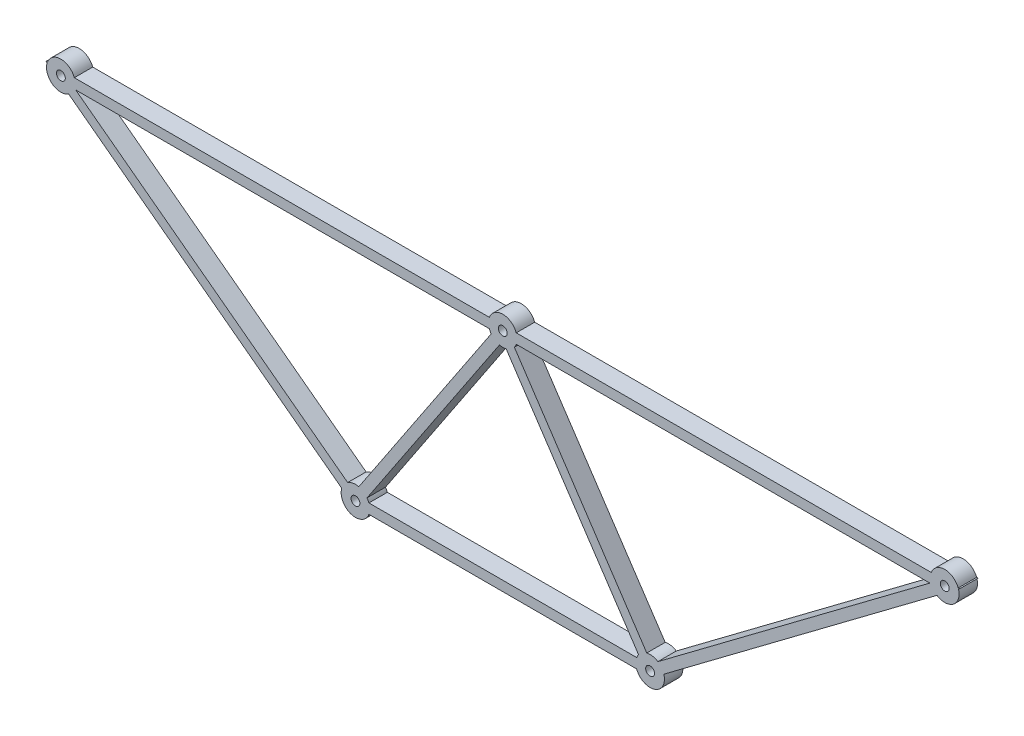
ISO-10303-21;
HEADER;
FILE_DESCRIPTION(('STEP AP214'),'2;1');
FILE_NAME('part.step','',(''),(''),'','','');
FILE_SCHEMA(('AUTOMOTIVE_DESIGN { 1 0 10303 214 1 1 1 1 }'));
ENDSEC;
DATA;
#1=APPLICATION_CONTEXT('core data for automotive mechanical design processes');
#2=APPLICATION_PROTOCOL_DEFINITION('international standard','automotive_design',2000,#1);
#3=PRODUCT_CONTEXT('',#1,'mechanical');
#4=PRODUCT('Part','Part','',(#3));
#5=PRODUCT_RELATED_PRODUCT_CATEGORY('part','',(#4));
#6=PRODUCT_DEFINITION_FORMATION('','',#4);
#7=PRODUCT_DEFINITION_CONTEXT('part definition',#1,'design');
#8=PRODUCT_DEFINITION('design','',#6,#7);
#9=PRODUCT_DEFINITION_SHAPE('','',#8);
#10=(LENGTH_UNIT() NAMED_UNIT(*) SI_UNIT(.MILLI.,.METRE.));
#11=(NAMED_UNIT(*) PLANE_ANGLE_UNIT() SI_UNIT($,.RADIAN.));
#12=(NAMED_UNIT(*) SI_UNIT($,.STERADIAN.) SOLID_ANGLE_UNIT());
#13=UNCERTAINTY_MEASURE_WITH_UNIT(LENGTH_MEASURE(1.E-05),#10,'distance_accuracy_value','');
#14=(GEOMETRIC_REPRESENTATION_CONTEXT(3) GLOBAL_UNCERTAINTY_ASSIGNED_CONTEXT((#13)) GLOBAL_UNIT_ASSIGNED_CONTEXT((#10,
#11,#12)) REPRESENTATION_CONTEXT('',''));
#15=CARTESIAN_POINT('',(0.,0.,0.));
#16=DIRECTION('',(0.,0.,1.));
#17=DIRECTION('',(1.,0.,0.));
#18=AXIS2_PLACEMENT_3D('',#15,#16,#17);
#19=CARTESIAN_POINT('',(-604.032,-5.376,12.5));
#20=DIRECTION('',(0.6,0.8,0.));
#21=DIRECTION('',(-0.8,0.6,0.));
#22=AXIS2_PLACEMENT_3D('',#19,#20,#21);
#23=PLANE('',#22);
#24=DIRECTION('',(0.,0.,-1.));
#25=VECTOR('',#24,1.);
#26=CARTESIAN_POINT('',(-589.42381804604,-16.3321364654699,12.5));
#27=LINE('',#26,#25);
#28=CARTESIAN_POINT('',(-589.42381804604,-16.3321364654699,-12.5));
#29=VERTEX_POINT('',#28);
#30=CARTESIAN_POINT('',(-589.42381804604,-16.3321364654699,12.5));
#31=VERTEX_POINT('',#30);
#32=EDGE_CURVE('E205',#29,#31,#27,.F.);
#33=ORIENTED_EDGE('',*,*,#32,.F.);
#34=DIRECTION('',(0.8,-0.6,0.));
#35=VECTOR('',#34,1.);
#36=CARTESIAN_POINT('',(-604.032,-5.376,-12.5));
#37=LINE('',#36,#35);
#38=CARTESIAN_POINT('',(-218.64018195396,-294.41986353453,-12.5));
#39=VERTEX_POINT('',#38);
#40=EDGE_CURVE('E617',#29,#39,#37,.T.);
#41=ORIENTED_EDGE('',*,*,#40,.T.);
#42=DIRECTION('',(0.,0.,-1.));
#43=VECTOR('',#42,1.);
#44=CARTESIAN_POINT('',(-218.64018195396,-294.41986353453,12.5));
#45=LINE('',#44,#43);
#46=CARTESIAN_POINT('',(-218.64018195396,-294.41986353453,12.5));
#47=VERTEX_POINT('',#46);
#48=EDGE_CURVE('E454',#47,#39,#45,.T.);
#49=ORIENTED_EDGE('',*,*,#48,.F.);
#50=DIRECTION('',(0.8,-0.6,0.));
#51=VECTOR('',#50,1.);
#52=CARTESIAN_POINT('',(-604.032,-5.376,12.5));
#53=LINE('',#52,#51);
#54=EDGE_CURVE('E589',#31,#47,#53,.T.);
#55=ORIENTED_EDGE('',*,*,#54,.F.);
#56=EDGE_LOOP('',(#33,#41,#49,#55));
#57=FACE_BOUND('',#56,.T.);
#58=ADVANCED_FACE('F181',(#57),#23,.F.);
#59=DIRECTION('',(0.,0.,-1.));
#60=VECTOR('',#59,1.);
#61=CARTESIAN_POINT('',(-618.64018195396,5.58013646546987,12.5));
#62=LINE('',#61,#60);
#63=CARTESIAN_POINT('',(-618.64018195396,5.58013646546988,12.5));
#64=VERTEX_POINT('',#63);
#65=CARTESIAN_POINT('',(-618.64018195396,5.58013646546988,-12.5));
#66=VERTEX_POINT('',#65);
#67=EDGE_CURVE('E431',#64,#66,#62,.T.);
#68=ORIENTED_EDGE('',*,*,#67,.F.);
#69=CARTESIAN_POINT('',(-620.16,6.72,12.5));
#70=VERTEX_POINT('',#69);
#71=EDGE_CURVE('E584',#70,#64,#53,.T.);
#72=ORIENTED_EDGE('',*,*,#71,.F.);
#73=DIRECTION('',(0.,0.,-1.));
#74=VECTOR('',#73,1.);
#75=CARTESIAN_POINT('',(-620.16,6.72,12.5));
#76=LINE('',#75,#74);
#77=CARTESIAN_POINT('',(-620.16,6.72,-12.5));
#78=VERTEX_POINT('',#77);
#79=EDGE_CURVE('E610',#70,#78,#76,.T.);
#80=ORIENTED_EDGE('',*,*,#79,.T.);
#81=EDGE_CURVE('E613',#78,#66,#37,.T.);
#82=ORIENTED_EDGE('',*,*,#81,.T.);
#83=EDGE_LOOP('',(#68,#72,#80,#82));
#84=FACE_BOUND('',#83,.T.);
#85=ADVANCED_FACE('F789',(#84),#23,.F.);
#86=CARTESIAN_POINT('',(-600.,6.72,12.5));
#87=DIRECTION('',(0.,-1.,0.));
#88=DIRECTION('',(0.,0.,-1.));
#89=AXIS2_PLACEMENT_3D('',#86,#87,#88);
#90=PLANE('',#89);
#91=DIRECTION('',(0.,0.,-1.));
#92=VECTOR('',#91,1.);
#93=CARTESIAN_POINT('',(-618.26022744245,6.72,12.5));
#94=LINE('',#93,#92);
#95=CARTESIAN_POINT('',(-618.26022744245,6.72,-12.5));
#96=VERTEX_POINT('',#95);
#97=CARTESIAN_POINT('',(-618.26022744245,6.72,12.5));
#98=VERTEX_POINT('',#97);
#99=EDGE_CURVE('E197',#96,#98,#94,.F.);
#100=ORIENTED_EDGE('',*,*,#99,.F.);
#101=DIRECTION('',(1.,0.,0.));
#102=VECTOR('',#101,1.);
#103=CARTESIAN_POINT('',(-600.,6.72,-12.5));
#104=LINE('',#103,#102);
#105=EDGE_CURVE('E402',#96,#78,#104,.F.);
#106=ORIENTED_EDGE('',*,*,#105,.T.);
#107=ORIENTED_EDGE('',*,*,#79,.F.);
#108=DIRECTION('',(1.,0.,0.));
#109=VECTOR('',#108,1.);
#110=CARTESIAN_POINT('',(-600.,6.72,12.5));
#111=LINE('',#110,#109);
#112=EDGE_CURVE('E605',#98,#70,#111,.F.);
#113=ORIENTED_EDGE('',*,*,#112,.F.);
#114=EDGE_LOOP('',(#100,#106,#107,#113));
#115=FACE_BOUND('',#114,.T.);
#116=ADVANCED_FACE('F794',(#115),#90,.F.);
#117=DIRECTION('',(0.,0.,-1.));
#118=VECTOR('',#117,1.);
#119=CARTESIAN_POINT('',(-581.73977255755,6.72,12.5));
#120=LINE('',#119,#118);
#121=CARTESIAN_POINT('',(-581.73977255755,6.72,12.5));
#122=VERTEX_POINT('',#121);
#123=CARTESIAN_POINT('',(-581.73977255755,6.72000000000002,-12.5));
#124=VERTEX_POINT('',#123);
#125=EDGE_CURVE('E394',#122,#124,#120,.T.);
#126=ORIENTED_EDGE('',*,*,#125,.F.);
#127=CARTESIAN_POINT('',(-18.2602274424499,6.72,12.5));
#128=VERTEX_POINT('',#127);
#129=EDGE_CURVE('E612',#128,#122,#111,.F.);
#130=ORIENTED_EDGE('',*,*,#129,.F.);
#131=DIRECTION('',(0.,0.,-1.));
#132=VECTOR('',#131,1.);
#133=CARTESIAN_POINT('',(-18.2602274424499,6.72,12.5));
#134=LINE('',#133,#132);
#135=CARTESIAN_POINT('',(-18.2602274424499,6.72,-12.5));
#136=VERTEX_POINT('',#135);
#137=EDGE_CURVE('E396',#136,#128,#134,.F.);
#138=ORIENTED_EDGE('',*,*,#137,.F.);
#139=EDGE_CURVE('E390',#136,#124,#104,.F.);
#140=ORIENTED_EDGE('',*,*,#139,.T.);
#141=EDGE_LOOP('',(#126,#130,#138,#140));
#142=FACE_BOUND('',#141,.T.);
#143=ADVANCED_FACE('F392',(#142),#90,.F.);
#144=CARTESIAN_POINT('',(200.,-293.28,12.5));
#145=DIRECTION('',(0.,-1.,0.));
#146=DIRECTION('',(1.,0.,0.));
#147=AXIS2_PLACEMENT_3D('',#144,#145,#146);
#148=PLANE('',#147);
#149=DIRECTION('',(0.,0.,-1.));
#150=VECTOR('',#149,1.);
#151=CARTESIAN_POINT('',(-181.73977255755,-293.28,12.5));
#152=LINE('',#151,#150);
#153=CARTESIAN_POINT('',(-181.73977255755,-293.28,12.5));
#154=VERTEX_POINT('',#153);
#155=CARTESIAN_POINT('',(-181.73977255755,-293.28,-12.5));
#156=VERTEX_POINT('',#155);
#157=EDGE_CURVE('E476',#154,#156,#152,.T.);
#158=ORIENTED_EDGE('',*,*,#157,.F.);
#159=DIRECTION('',(-1.,0.,0.));
#160=VECTOR('',#159,1.);
#161=CARTESIAN_POINT('',(200.,-293.28,12.5));
#162=LINE('',#161,#160);
#163=CARTESIAN_POINT('',(181.73977255755,-293.28,12.5));
#164=VERTEX_POINT('',#163);
#165=EDGE_CURVE('E649',#164,#154,#162,.T.);
#166=ORIENTED_EDGE('',*,*,#165,.F.);
#167=DIRECTION('',(0.,0.,-1.));
#168=VECTOR('',#167,1.);
#169=CARTESIAN_POINT('',(181.73977255755,-293.28,12.5));
#170=LINE('',#169,#168);
#171=CARTESIAN_POINT('',(181.73977255755,-293.28,-12.5));
#172=VERTEX_POINT('',#171);
#173=EDGE_CURVE('E496',#172,#164,#170,.F.);
#174=ORIENTED_EDGE('',*,*,#173,.F.);
#175=DIRECTION('',(-1.,0.,0.));
#176=VECTOR('',#175,1.);
#177=CARTESIAN_POINT('',(200.,-293.28,-12.5));
#178=LINE('',#177,#176);
#179=EDGE_CURVE('E657',#172,#156,#178,.T.);
#180=ORIENTED_EDGE('',*,*,#179,.T.);
#181=EDGE_LOOP('',(#158,#166,#174,#180));
#182=FACE_BOUND('',#181,.T.);
#183=ADVANCED_FACE('F801',(#182),#148,.F.);
#184=CARTESIAN_POINT('',(200.,-306.72,12.5));
#185=DIRECTION('',(0.,-1.,0.));
#186=DIRECTION('',(1.,0.,0.));
#187=AXIS2_PLACEMENT_3D('',#184,#185,#186);
#188=PLANE('',#187);
#189=DIRECTION('',(-1.,0.,0.));
#190=VECTOR('',#189,1.);
#191=CARTESIAN_POINT('',(200.,-306.72,12.5));
#192=LINE('',#191,#190);
#193=CARTESIAN_POINT('',(181.73977255755,-306.72,12.5));
#194=VERTEX_POINT('',#193);
#195=CARTESIAN_POINT('',(-181.73977255755,-306.72,12.5));
#196=VERTEX_POINT('',#195);
#197=EDGE_CURVE('E653',#194,#196,#192,.T.);
#198=ORIENTED_EDGE('',*,*,#197,.T.);
#199=DIRECTION('',(0.,0.,-1.));
#200=VECTOR('',#199,1.);
#201=CARTESIAN_POINT('',(-181.73977255755,-306.72,12.5));
#202=LINE('',#201,#200);
#203=CARTESIAN_POINT('',(-181.73977255755,-306.72,-12.5));
#204=VERTEX_POINT('',#203);
#205=EDGE_CURVE('E473',#196,#204,#202,.T.);
#206=ORIENTED_EDGE('',*,*,#205,.T.);
#207=DIRECTION('',(-1.,0.,0.));
#208=VECTOR('',#207,1.);
#209=CARTESIAN_POINT('',(200.,-306.72,-12.5));
#210=LINE('',#209,#208);
#211=CARTESIAN_POINT('',(181.73977255755,-306.72,-12.5));
#212=VERTEX_POINT('',#211);
#213=EDGE_CURVE('E654',#212,#204,#210,.T.);
#214=ORIENTED_EDGE('',*,*,#213,.F.);
#215=DIRECTION('',(0.,0.,-1.));
#216=VECTOR('',#215,1.);
#217=CARTESIAN_POINT('',(181.73977255755,-306.72,12.5));
#218=LINE('',#217,#216);
#219=EDGE_CURVE('E12',#212,#194,#218,.F.);
#220=ORIENTED_EDGE('',*,*,#219,.T.);
#221=EDGE_LOOP('',(#198,#206,#214,#220));
#222=FACE_BOUND('',#221,.T.);
#223=ADVANCED_FACE('F798',(#222),#188,.T.);
#224=CARTESIAN_POINT('',(-5.59137797795031,3.72758531863354,12.5));
#225=DIRECTION('',(-0.832050294337844,0.554700196225229,0.));
#226=DIRECTION('',(-0.554700196225229,-0.832050294337844,0.));
#227=AXIS2_PLACEMENT_3D('',#224,#225,#226);
#228=PLANE('',#227);
#229=DIRECTION('',(0.554700196225229,0.832050294337843,0.));
#230=VECTOR('',#229,1.);
#231=CARTESIAN_POINT('',(-5.59137797795031,3.72758531863354,-12.5));
#232=LINE('',#231,#230);
#233=CARTESIAN_POINT('',(-195.462426232506,-281.0789870632,-12.5));
#234=VERTEX_POINT('',#233);
#235=CARTESIAN_POINT('',(-15.7203297233946,-11.4658422995329,-12.5));
#236=VERTEX_POINT('',#235);
#237=EDGE_CURVE('E684',#234,#236,#232,.T.);
#238=ORIENTED_EDGE('',*,*,#237,.F.);
#239=DIRECTION('',(0.,0.,-1.));
#240=VECTOR('',#239,1.);
#241=CARTESIAN_POINT('',(-195.462426232506,-281.0789870632,12.5));
#242=LINE('',#241,#240);
#243=CARTESIAN_POINT('',(-195.462426232506,-281.0789870632,12.5));
#244=VERTEX_POINT('',#243);
#245=EDGE_CURVE('E469',#234,#244,#242,.F.);
#246=ORIENTED_EDGE('',*,*,#245,.T.);
#247=DIRECTION('',(0.554700196225229,0.832050294337843,0.));
#248=VECTOR('',#247,1.);
#249=CARTESIAN_POINT('',(-5.59137797795031,3.72758531863354,12.5));
#250=LINE('',#249,#248);
#251=CARTESIAN_POINT('',(-15.7203297233946,-11.4658422995329,12.5));
#252=VERTEX_POINT('',#251);
#253=EDGE_CURVE('E673',#244,#252,#250,.T.);
#254=ORIENTED_EDGE('',*,*,#253,.T.);
#255=DIRECTION('',(0.,0.,-1.));
#256=VECTOR('',#255,1.);
#257=CARTESIAN_POINT('',(-15.7203297233946,-11.4658422995329,12.5));
#258=LINE('',#257,#256);
#259=EDGE_CURVE('E561',#252,#236,#258,.T.);
#260=ORIENTED_EDGE('',*,*,#259,.T.);
#261=EDGE_LOOP('',(#238,#246,#254,#260));
#262=FACE_BOUND('',#261,.T.);
#263=ADVANCED_FACE('F745',(#262),#228,.T.);
#264=CARTESIAN_POINT('',(5.59137797795031,-3.72758531863354,12.5));
#265=DIRECTION('',(-0.832050294337844,0.554700196225229,0.));
#266=DIRECTION('',(-0.554700196225229,-0.832050294337844,0.));
#267=AXIS2_PLACEMENT_3D('',#264,#265,#266);
#268=PLANE('',#267);
#269=DIRECTION('',(0.,0.,-1.));
#270=VECTOR('',#269,1.);
#271=CARTESIAN_POINT('',(-184.279670276605,-288.534157700467,12.5));
#272=LINE('',#271,#270);
#273=CARTESIAN_POINT('',(-184.279670276605,-288.534157700467,-12.5));
#274=VERTEX_POINT('',#273);
#275=CARTESIAN_POINT('',(-184.279670276605,-288.534157700467,12.5));
#276=VERTEX_POINT('',#275);
#277=EDGE_CURVE('E465',#274,#276,#272,.F.);
#278=ORIENTED_EDGE('',*,*,#277,.F.);
#279=DIRECTION('',(0.554700196225229,0.832050294337843,0.));
#280=VECTOR('',#279,1.);
#281=CARTESIAN_POINT('',(5.59137797795031,-3.72758531863354,-12.5));
#282=LINE('',#281,#280);
#283=CARTESIAN_POINT('',(-4.53757376749396,-18.9210129367999,-12.5));
#284=VERTEX_POINT('',#283);
#285=EDGE_CURVE('E669',#274,#284,#282,.T.);
#286=ORIENTED_EDGE('',*,*,#285,.T.);
#287=DIRECTION('',(0.,0.,-1.));
#288=VECTOR('',#287,1.);
#289=CARTESIAN_POINT('',(-4.53757376749396,-18.9210129367999,12.5));
#290=LINE('',#289,#288);
#291=CARTESIAN_POINT('',(-4.53757376749396,-18.9210129367999,12.5));
#292=VERTEX_POINT('',#291);
#293=EDGE_CURVE('E551',#292,#284,#290,.T.);
#294=ORIENTED_EDGE('',*,*,#293,.F.);
#295=DIRECTION('',(0.554700196225229,0.832050294337843,0.));
#296=VECTOR('',#295,1.);
#297=CARTESIAN_POINT('',(5.59137797795031,-3.72758531863354,12.5));
#298=LINE('',#297,#296);
#299=EDGE_CURVE('E660',#276,#292,#298,.T.);
#300=ORIENTED_EDGE('',*,*,#299,.F.);
#301=EDGE_LOOP('',(#278,#286,#294,#300));
#302=FACE_BOUND('',#301,.T.);
#303=ADVANCED_FACE('F806',(#302),#268,.F.);
#304=CARTESIAN_POINT('',(-595.968,5.376,12.5));
#305=DIRECTION('',(0.6,0.8,0.));
#306=DIRECTION('',(-0.8,0.6,0.));
#307=AXIS2_PLACEMENT_3D('',#304,#305,#306);
#308=PLANE('',#307);
#309=DIRECTION('',(0.8,-0.6,0.));
#310=VECTOR('',#309,1.);
#311=CARTESIAN_POINT('',(-595.968,5.376,12.5));
#312=LINE('',#311,#310);
#313=CARTESIAN_POINT('',(-579.84,-6.72,12.5));
#314=VERTEX_POINT('',#313);
#315=CARTESIAN_POINT('',(-210.57618195396,-283.66786353453,12.5));
#316=VERTEX_POINT('',#315);
#317=EDGE_CURVE('E588',#314,#316,#312,.T.);
#318=ORIENTED_EDGE('',*,*,#317,.T.);
#319=DIRECTION('',(0.,0.,-1.));
#320=VECTOR('',#319,1.);
#321=CARTESIAN_POINT('',(-210.57618195396,-283.66786353453,12.5));
#322=LINE('',#321,#320);
#323=CARTESIAN_POINT('',(-210.57618195396,-283.66786353453,-12.5));
#324=VERTEX_POINT('',#323);
#325=EDGE_CURVE('E461',#316,#324,#322,.T.);
#326=ORIENTED_EDGE('',*,*,#325,.T.);
#327=DIRECTION('',(0.8,-0.6,0.));
#328=VECTOR('',#327,1.);
#329=CARTESIAN_POINT('',(-595.968,5.376,-12.5));
#330=LINE('',#329,#328);
#331=CARTESIAN_POINT('',(-579.84,-6.72,-12.5));
#332=VERTEX_POINT('',#331);
#333=EDGE_CURVE('E616',#332,#324,#330,.T.);
#334=ORIENTED_EDGE('',*,*,#333,.F.);
#335=DIRECTION('',(0.,0.,-1.));
#336=VECTOR('',#335,1.);
#337=CARTESIAN_POINT('',(-579.84,-6.72,12.5));
#338=LINE('',#337,#336);
#339=EDGE_CURVE('E645',#314,#332,#338,.T.);
#340=ORIENTED_EDGE('',*,*,#339,.F.);
#341=EDGE_LOOP('',(#318,#326,#334,#340));
#342=FACE_BOUND('',#341,.T.);
#343=ADVANCED_FACE('F773',(#342),#308,.T.);
#344=CARTESIAN_POINT('',(604.032,-5.376,12.5));
#345=DIRECTION('',(-0.6,0.8,0.));
#346=DIRECTION('',(-0.8,-0.6,0.));
#347=AXIS2_PLACEMENT_3D('',#344,#345,#346);
#348=PLANE('',#347);
#349=DIRECTION('',(0.,0.,-1.));
#350=VECTOR('',#349,1.);
#351=CARTESIAN_POINT('',(218.64018195396,-294.41986353453,12.5));
#352=LINE('',#351,#350);
#353=CARTESIAN_POINT('',(218.64018195396,-294.41986353453,-12.5));
#354=VERTEX_POINT('',#353);
#355=CARTESIAN_POINT('',(218.64018195396,-294.41986353453,12.5));
#356=VERTEX_POINT('',#355);
#357=EDGE_CURVE('E516',#354,#356,#352,.F.);
#358=ORIENTED_EDGE('',*,*,#357,.F.);
#359=DIRECTION('',(0.8,0.6,0.));
#360=VECTOR('',#359,1.);
#361=CARTESIAN_POINT('',(604.032,-5.376,-12.5));
#362=LINE('',#361,#360);
#363=CARTESIAN_POINT('',(589.42381804604,-16.3321364654699,-12.5));
#364=VERTEX_POINT('',#363);
#365=EDGE_CURVE('E630',#354,#364,#362,.T.);
#366=ORIENTED_EDGE('',*,*,#365,.T.);
#367=DIRECTION('',(0.,0.,-1.));
#368=VECTOR('',#367,1.);
#369=CARTESIAN_POINT('',(589.42381804604,-16.3321364654699,12.5));
#370=LINE('',#369,#368);
#371=CARTESIAN_POINT('',(589.42381804604,-16.3321364654699,12.5));
#372=VERTEX_POINT('',#371);
#373=EDGE_CURVE('E530',#372,#364,#370,.T.);
#374=ORIENTED_EDGE('',*,*,#373,.F.);
#375=DIRECTION('',(0.8,0.6,0.));
#376=VECTOR('',#375,1.);
#377=CARTESIAN_POINT('',(604.032,-5.376,12.5));
#378=LINE('',#377,#376);
#379=EDGE_CURVE('E602',#356,#372,#378,.T.);
#380=ORIENTED_EDGE('',*,*,#379,.F.);
#381=EDGE_LOOP('',(#358,#366,#374,#380));
#382=FACE_BOUND('',#381,.T.);
#383=ADVANCED_FACE('F812',(#382),#348,.F.);
#384=CARTESIAN_POINT('',(5.59137797795031,3.72758531863354,12.5));
#385=DIRECTION('',(0.832050294337843,0.554700196225229,0.));
#386=DIRECTION('',(-0.55470019622523,0.832050294337843,0.));
#387=AXIS2_PLACEMENT_3D('',#384,#385,#386);
#388=PLANE('',#387);
#389=DIRECTION('',(0.55470019622523,-0.832050294337843,0.));
#390=VECTOR('',#389,1.);
#391=CARTESIAN_POINT('',(5.59137797795031,3.72758531863354,12.5));
#392=LINE('',#391,#390);
#393=CARTESIAN_POINT('',(15.7203297233946,-11.4658422995329,12.5));
#394=VERTEX_POINT('',#393);
#395=CARTESIAN_POINT('',(195.462426232506,-281.0789870632,12.5));
#396=VERTEX_POINT('',#395);
#397=EDGE_CURVE('E668',#394,#396,#392,.T.);
#398=ORIENTED_EDGE('',*,*,#397,.T.);
#399=DIRECTION('',(0.,0.,-1.));
#400=VECTOR('',#399,1.);
#401=CARTESIAN_POINT('',(195.462426232506,-281.0789870632,12.5));
#402=LINE('',#401,#400);
#403=CARTESIAN_POINT('',(195.462426232506,-281.0789870632,-12.5));
#404=VERTEX_POINT('',#403);
#405=EDGE_CURVE('E512',#396,#404,#402,.T.);
#406=ORIENTED_EDGE('',*,*,#405,.T.);
#407=DIRECTION('',(0.55470019622523,-0.832050294337843,0.));
#408=VECTOR('',#407,1.);
#409=CARTESIAN_POINT('',(5.59137797795031,3.72758531863354,-12.5));
#410=LINE('',#409,#408);
#411=CARTESIAN_POINT('',(15.7203297233946,-11.4658422995329,-12.5));
#412=VERTEX_POINT('',#411);
#413=EDGE_CURVE('E680',#412,#404,#410,.T.);
#414=ORIENTED_EDGE('',*,*,#413,.F.);
#415=DIRECTION('',(0.,0.,-1.));
#416=VECTOR('',#415,1.);
#417=CARTESIAN_POINT('',(15.7203297233946,-11.4658422995329,12.5));
#418=LINE('',#417,#416);
#419=EDGE_CURVE('E565',#412,#394,#418,.F.);
#420=ORIENTED_EDGE('',*,*,#419,.T.);
#421=EDGE_LOOP('',(#398,#406,#414,#420));
#422=FACE_BOUND('',#421,.T.);
#423=ADVANCED_FACE('F727',(#422),#388,.T.);
#424=CARTESIAN_POINT('',(-5.59137797795031,-3.72758531863354,12.5));
#425=DIRECTION('',(0.832050294337843,0.554700196225229,0.));
#426=DIRECTION('',(-0.55470019622523,0.832050294337843,0.));
#427=AXIS2_PLACEMENT_3D('',#424,#425,#426);
#428=PLANE('',#427);
#429=DIRECTION('',(0.,0.,-1.));
#430=VECTOR('',#429,1.);
#431=CARTESIAN_POINT('',(184.279670276605,-288.534157700467,12.5));
#432=LINE('',#431,#430);
#433=CARTESIAN_POINT('',(184.279670276605,-288.534157700467,12.5));
#434=VERTEX_POINT('',#433);
#435=CARTESIAN_POINT('',(184.279670276605,-288.534157700467,-12.5));
#436=VERTEX_POINT('',#435);
#437=EDGE_CURVE('E508',#434,#436,#432,.T.);
#438=ORIENTED_EDGE('',*,*,#437,.F.);
#439=DIRECTION('',(0.55470019622523,-0.832050294337843,0.));
#440=VECTOR('',#439,1.);
#441=CARTESIAN_POINT('',(-5.59137797795031,-3.72758531863354,12.5));
#442=LINE('',#441,#440);
#443=CARTESIAN_POINT('',(4.53757376749397,-18.9210129367999,12.5));
#444=VERTEX_POINT('',#443);
#445=EDGE_CURVE('E664',#444,#434,#442,.T.);
#446=ORIENTED_EDGE('',*,*,#445,.F.);
#447=DIRECTION('',(0.,0.,-1.));
#448=VECTOR('',#447,1.);
#449=CARTESIAN_POINT('',(4.53757376749397,-18.9210129367999,12.5));
#450=LINE('',#449,#448);
#451=CARTESIAN_POINT('',(4.53757376749397,-18.9210129367999,-12.5));
#452=VERTEX_POINT('',#451);
#453=EDGE_CURVE('E190',#452,#444,#450,.F.);
#454=ORIENTED_EDGE('',*,*,#453,.F.);
#455=DIRECTION('',(0.55470019622523,-0.832050294337843,0.));
#456=VECTOR('',#455,1.);
#457=CARTESIAN_POINT('',(-5.59137797795031,-3.72758531863354,-12.5));
#458=LINE('',#457,#456);
#459=EDGE_CURVE('E583',#452,#436,#458,.T.);
#460=ORIENTED_EDGE('',*,*,#459,.T.);
#461=EDGE_LOOP('',(#438,#446,#454,#460));
#462=FACE_BOUND('',#461,.T.);
#463=ADVANCED_FACE('F183',(#462),#428,.F.);
#464=CARTESIAN_POINT('',(595.968,5.376,12.5));
#465=DIRECTION('',(-0.6,0.8,0.));
#466=DIRECTION('',(-0.8,-0.6,0.));
#467=AXIS2_PLACEMENT_3D('',#464,#465,#466);
#468=PLANE('',#467);
#469=DIRECTION('',(0.8,0.6,0.));
#470=VECTOR('',#469,1.);
#471=CARTESIAN_POINT('',(595.968,5.376,-12.5));
#472=LINE('',#471,#470);
#473=CARTESIAN_POINT('',(210.57618195396,-283.66786353453,-12.5));
#474=VERTEX_POINT('',#473);
#475=CARTESIAN_POINT('',(579.84,-6.72,-12.5));
#476=VERTEX_POINT('',#475);
#477=EDGE_CURVE('E626',#474,#476,#472,.T.);
#478=ORIENTED_EDGE('',*,*,#477,.F.);
#479=DIRECTION('',(0.,0.,-1.));
#480=VECTOR('',#479,1.);
#481=CARTESIAN_POINT('',(210.57618195396,-283.66786353453,12.5));
#482=LINE('',#481,#480);
#483=CARTESIAN_POINT('',(210.57618195396,-283.66786353453,12.5));
#484=VERTEX_POINT('',#483);
#485=EDGE_CURVE('E504',#474,#484,#482,.F.);
#486=ORIENTED_EDGE('',*,*,#485,.T.);
#487=DIRECTION('',(0.8,0.6,0.));
#488=VECTOR('',#487,1.);
#489=CARTESIAN_POINT('',(595.968,5.376,12.5));
#490=LINE('',#489,#488);
#491=CARTESIAN_POINT('',(579.84,-6.72,12.5));
#492=VERTEX_POINT('',#491);
#493=EDGE_CURVE('E598',#484,#492,#490,.T.);
#494=ORIENTED_EDGE('',*,*,#493,.T.);
#495=DIRECTION('',(0.,0.,-1.));
#496=VECTOR('',#495,1.);
#497=CARTESIAN_POINT('',(579.84,-6.72,12.5));
#498=LINE('',#497,#496);
#499=EDGE_CURVE('E641',#492,#476,#498,.T.);
#500=ORIENTED_EDGE('',*,*,#499,.T.);
#501=EDGE_LOOP('',(#478,#486,#494,#500));
#502=FACE_BOUND('',#501,.T.);
#503=ADVANCED_FACE('F723',(#502),#468,.T.);
#504=DIRECTION('',(0.,0.,-1.));
#505=VECTOR('',#504,1.);
#506=CARTESIAN_POINT('',(581.73977255755,6.72,12.5));
#507=LINE('',#506,#505);
#508=CARTESIAN_POINT('',(581.73977255755,6.72,-12.5));
#509=VERTEX_POINT('',#508);
#510=CARTESIAN_POINT('',(581.73977255755,6.72,12.5));
#511=VERTEX_POINT('',#510);
#512=EDGE_CURVE('E542',#509,#511,#507,.F.);
#513=ORIENTED_EDGE('',*,*,#512,.F.);
#514=CARTESIAN_POINT('',(18.2602274424499,6.72,-12.5));
#515=VERTEX_POINT('',#514);
#516=EDGE_CURVE('E401',#509,#515,#104,.F.);
#517=ORIENTED_EDGE('',*,*,#516,.T.);
#518=DIRECTION('',(0.,0.,-1.));
#519=VECTOR('',#518,1.);
#520=CARTESIAN_POINT('',(18.2602274424499,6.72,12.5));
#521=LINE('',#520,#519);
#522=CARTESIAN_POINT('',(18.2602274424499,6.72,12.5));
#523=VERTEX_POINT('',#522);
#524=EDGE_CURVE('E575',#523,#515,#521,.T.);
#525=ORIENTED_EDGE('',*,*,#524,.F.);
#526=EDGE_CURVE('E611',#511,#523,#111,.F.);
#527=ORIENTED_EDGE('',*,*,#526,.F.);
#528=EDGE_LOOP('',(#513,#517,#525,#527));
#529=FACE_BOUND('',#528,.T.);
#530=ADVANCED_FACE('F831',(#529),#90,.F.);
#531=DIRECTION('',(0.,0.,-1.));
#532=VECTOR('',#531,1.);
#533=CARTESIAN_POINT('',(618.26022744245,6.72,12.5));
#534=LINE('',#533,#532);
#535=CARTESIAN_POINT('',(618.26022744245,6.72,12.5));
#536=VERTEX_POINT('',#535);
#537=CARTESIAN_POINT('',(618.26022744245,6.72000000000002,-12.5));
#538=VERTEX_POINT('',#537);
#539=EDGE_CURVE('E538',#536,#538,#534,.T.);
#540=ORIENTED_EDGE('',*,*,#539,.F.);
#541=CARTESIAN_POINT('',(620.16,6.72,12.5));
#542=VERTEX_POINT('',#541);
#543=EDGE_CURVE('E606',#542,#536,#111,.F.);
#544=ORIENTED_EDGE('',*,*,#543,.F.);
#545=DIRECTION('',(0.,0.,-1.));
#546=VECTOR('',#545,1.);
#547=CARTESIAN_POINT('',(620.16,6.72,12.5));
#548=LINE('',#547,#546);
#549=CARTESIAN_POINT('',(620.16,6.72,-12.5));
#550=VERTEX_POINT('',#549);
#551=EDGE_CURVE('E637',#542,#550,#548,.T.);
#552=ORIENTED_EDGE('',*,*,#551,.T.);
#553=EDGE_CURVE('E404',#550,#538,#104,.F.);
#554=ORIENTED_EDGE('',*,*,#553,.T.);
#555=EDGE_LOOP('',(#540,#544,#552,#554));
#556=FACE_BOUND('',#555,.T.);
#557=ADVANCED_FACE('F825',(#556),#90,.F.);
#558=DIRECTION('',(0.,0.,-1.));
#559=VECTOR('',#558,1.);
#560=CARTESIAN_POINT('',(618.64018195396,5.58013646546988,12.5));
#561=LINE('',#560,#559);
#562=CARTESIAN_POINT('',(618.64018195396,5.58013646546988,-12.5));
#563=VERTEX_POINT('',#562);
#564=CARTESIAN_POINT('',(618.64018195396,5.58013646546988,12.5));
#565=VERTEX_POINT('',#564);
#566=EDGE_CURVE('E534',#563,#565,#561,.F.);
#567=ORIENTED_EDGE('',*,*,#566,.F.);
#568=EDGE_CURVE('E629',#563,#550,#362,.T.);
#569=ORIENTED_EDGE('',*,*,#568,.T.);
#570=ORIENTED_EDGE('',*,*,#551,.F.);
#571=EDGE_CURVE('E601',#565,#542,#378,.T.);
#572=ORIENTED_EDGE('',*,*,#571,.F.);
#573=EDGE_LOOP('',(#567,#569,#570,#572));
#574=FACE_BOUND('',#573,.T.);
#575=ADVANCED_FACE('F819',(#574),#348,.F.);
#576=CARTESIAN_POINT('',(-600.,-6.72,12.5));
#577=DIRECTION('',(0.,-1.,0.));
#578=DIRECTION('',(0.,0.,-1.));
#579=AXIS2_PLACEMENT_3D('',#576,#577,#578);
#580=PLANE('',#579);
#581=DIRECTION('',(1.,0.,0.));
#582=VECTOR('',#581,1.);
#583=CARTESIAN_POINT('',(-600.,-6.72,12.5));
#584=LINE('',#583,#582);
#585=CARTESIAN_POINT('',(18.2602274424499,-6.72,12.5));
#586=VERTEX_POINT('',#585);
#587=EDGE_CURVE('E594',#492,#586,#584,.F.);
#588=ORIENTED_EDGE('',*,*,#587,.T.);
#589=DIRECTION('',(0.,0.,-1.));
#590=VECTOR('',#589,1.);
#591=CARTESIAN_POINT('',(18.2602274424499,-6.72,12.5));
#592=LINE('',#591,#590);
#593=CARTESIAN_POINT('',(18.2602274424499,-6.72,-12.5));
#594=VERTEX_POINT('',#593);
#595=EDGE_CURVE('E579',#586,#594,#592,.T.);
#596=ORIENTED_EDGE('',*,*,#595,.T.);
#597=DIRECTION('',(1.,0.,0.));
#598=VECTOR('',#597,1.);
#599=CARTESIAN_POINT('',(-600.,-6.72,-12.5));
#600=LINE('',#599,#598);
#601=EDGE_CURVE('E622',#476,#594,#600,.F.);
#602=ORIENTED_EDGE('',*,*,#601,.F.);
#603=ORIENTED_EDGE('',*,*,#499,.F.);
#604=EDGE_LOOP('',(#588,#596,#602,#603));
#605=FACE_BOUND('',#604,.T.);
#606=ADVANCED_FACE('F719',(#605),#580,.T.);
#607=CARTESIAN_POINT('',(-18.2602274424499,-6.72,-12.5));
#608=VERTEX_POINT('',#607);
#609=EDGE_CURVE('E621',#608,#332,#600,.F.);
#610=ORIENTED_EDGE('',*,*,#609,.F.);
#611=DIRECTION('',(0.,0.,-1.));
#612=VECTOR('',#611,1.);
#613=CARTESIAN_POINT('',(-18.2602274424499,-6.72,12.5));
#614=LINE('',#613,#612);
#615=CARTESIAN_POINT('',(-18.2602274424499,-6.72,12.5));
#616=VERTEX_POINT('',#615);
#617=EDGE_CURVE('E571',#608,#616,#614,.F.);
#618=ORIENTED_EDGE('',*,*,#617,.T.);
#619=EDGE_CURVE('E593',#616,#314,#584,.F.);
#620=ORIENTED_EDGE('',*,*,#619,.T.);
#621=ORIENTED_EDGE('',*,*,#339,.T.);
#622=EDGE_LOOP('',(#610,#618,#620,#621));
#623=FACE_BOUND('',#622,.T.);
#624=ADVANCED_FACE('F752',(#623),#580,.T.);
#625=CARTESIAN_POINT('',(0.,0.,-12.5));
#626=DIRECTION('',(0.,0.,-1.));
#627=DIRECTION('',(-1.,0.,0.));
#628=AXIS2_PLACEMENT_3D('',#625,#626,#627);
#629=PLANE('',#628);
#630=CARTESIAN_POINT('',(-600.,0.,-12.5));
#631=DIRECTION('',(0.,0.,1.));
#632=DIRECTION('',(1.,0.,0.));
#633=AXIS2_PLACEMENT_3D('',#630,#631,#632);
#634=CIRCLE('',#633,6.01749999999996);
#635=CARTESIAN_POINT('',(-593.9825,0.,-12.5));
#636=VERTEX_POINT('',#635);
#637=EDGE_CURVE('E1250',#636,#636,#634,.T.);
#638=ORIENTED_EDGE('',*,*,#637,.T.);
#639=EDGE_LOOP('',(#638));
#640=FACE_BOUND('',#639,.T.);
#641=CARTESIAN_POINT('',(-200.,-300.,-12.5));
#642=DIRECTION('',(0.,0.,1.));
#643=DIRECTION('',(1.,0.,0.));
#644=AXIS2_PLACEMENT_3D('',#641,#642,#643);
#645=CIRCLE('',#644,6.01750000000001);
#646=CARTESIAN_POINT('',(-193.9825,-300.,-12.5));
#647=VERTEX_POINT('',#646);
#648=EDGE_CURVE('E450',#647,#647,#645,.T.);
#649=ORIENTED_EDGE('',*,*,#648,.T.);
#650=EDGE_LOOP('',(#649));
#651=FACE_BOUND('',#650,.T.);
#652=CARTESIAN_POINT('',(200.,-300.,-12.5));
#653=DIRECTION('',(0.,0.,1.));
#654=DIRECTION('',(1.,0.,0.));
#655=AXIS2_PLACEMENT_3D('',#652,#653,#654);
#656=CIRCLE('',#655,6.01750000000001);
#657=CARTESIAN_POINT('',(206.0175,-300.,-12.5));
#658=VERTEX_POINT('',#657);
#659=EDGE_CURVE('E492',#658,#658,#656,.T.);
#660=ORIENTED_EDGE('',*,*,#659,.T.);
#661=EDGE_LOOP('',(#660));
#662=FACE_BOUND('',#661,.T.);
#663=CARTESIAN_POINT('',(600.,0.,-12.5));
#664=DIRECTION('',(0.,0.,1.));
#665=DIRECTION('',(1.,0.,0.));
#666=AXIS2_PLACEMENT_3D('',#663,#664,#665);
#667=CIRCLE('',#666,6.01749999999996);
#668=CARTESIAN_POINT('',(606.0175,0.,-12.5));
#669=VERTEX_POINT('',#668);
#670=EDGE_CURVE('E1255',#669,#669,#667,.T.);
#671=ORIENTED_EDGE('',*,*,#670,.T.);
#672=EDGE_LOOP('',(#671));
#673=FACE_BOUND('',#672,.T.);
#674=CARTESIAN_POINT('',(0.,0.,-12.5));
#675=DIRECTION('',(0.,0.,1.));
#676=DIRECTION('',(1.,0.,0.));
#677=AXIS2_PLACEMENT_3D('',#674,#675,#676);
#678=CIRCLE('',#677,6.0175);
#679=CARTESIAN_POINT('',(6.0175,0.,-12.5));
#680=VERTEX_POINT('',#679);
#681=EDGE_CURVE('E424',#680,#680,#678,.T.);
#682=ORIENTED_EDGE('',*,*,#681,.T.);
#683=EDGE_LOOP('',(#682));
#684=FACE_BOUND('',#683,.T.);
#685=ORIENTED_EDGE('',*,*,#105,.F.);
#686=CARTESIAN_POINT('',(-600.,0.,-12.5));
#687=DIRECTION('',(0.,0.,1.));
#688=DIRECTION('',(1.,0.,0.));
#689=AXIS2_PLACEMENT_3D('',#686,#687,#688);
#690=CIRCLE('',#689,19.4575);
#691=EDGE_CURVE('E409',#124,#96,#690,.T.);
#692=ORIENTED_EDGE('',*,*,#691,.F.);
#693=ORIENTED_EDGE('',*,*,#139,.F.);
#694=CARTESIAN_POINT('',(0.,0.,-12.5));
#695=DIRECTION('',(0.,0.,1.));
#696=DIRECTION('',(1.,0.,0.));
#697=AXIS2_PLACEMENT_3D('',#694,#695,#696);
#698=CIRCLE('',#697,19.4575);
#699=EDGE_CURVE('E554',#515,#136,#698,.T.);
#700=ORIENTED_EDGE('',*,*,#699,.F.);
#701=ORIENTED_EDGE('',*,*,#516,.F.);
#702=CARTESIAN_POINT('',(600.,0.,-12.5));
#703=DIRECTION('',(0.,0.,1.));
#704=DIRECTION('',(1.,0.,0.));
#705=AXIS2_PLACEMENT_3D('',#702,#703,#704);
#706=CIRCLE('',#705,19.4575);
#707=EDGE_CURVE('E525',#538,#509,#706,.T.);
#708=ORIENTED_EDGE('',*,*,#707,.F.);
#709=ORIENTED_EDGE('',*,*,#553,.F.);
#710=ORIENTED_EDGE('',*,*,#568,.F.);
#711=EDGE_CURVE('E521',#364,#563,#706,.T.);
#712=ORIENTED_EDGE('',*,*,#711,.F.);
#713=ORIENTED_EDGE('',*,*,#365,.F.);
#714=CARTESIAN_POINT('',(200.,-300.,-12.5));
#715=DIRECTION('',(0.,0.,1.));
#716=DIRECTION('',(1.,0.,0.));
#717=AXIS2_PLACEMENT_3D('',#714,#715,#716);
#718=CIRCLE('',#717,19.4575);
#719=EDGE_CURVE('E481',#212,#354,#718,.T.);
#720=ORIENTED_EDGE('',*,*,#719,.F.);
#721=ORIENTED_EDGE('',*,*,#213,.T.);
#722=CARTESIAN_POINT('',(-200.,-300.,-12.5));
#723=DIRECTION('',(0.,0.,1.));
#724=DIRECTION('',(1.,0.,0.));
#725=AXIS2_PLACEMENT_3D('',#722,#723,#724);
#726=CIRCLE('',#725,19.4575);
#727=EDGE_CURVE('E444',#39,#204,#726,.T.);
#728=ORIENTED_EDGE('',*,*,#727,.F.);
#729=ORIENTED_EDGE('',*,*,#40,.F.);
#730=EDGE_CURVE('E418',#66,#29,#690,.T.);
#731=ORIENTED_EDGE('',*,*,#730,.F.);
#732=ORIENTED_EDGE('',*,*,#81,.F.);
#733=EDGE_LOOP('',(#685,#692,#693,#700,#701,#708,#709,#710,#712,#713,#720,#721,#728,#729,#731,#732));
#734=FACE_BOUND('',#733,.T.);
#735=ORIENTED_EDGE('',*,*,#413,.T.);
#736=EDGE_CURVE('E487',#474,#404,#718,.T.);
#737=ORIENTED_EDGE('',*,*,#736,.F.);
#738=ORIENTED_EDGE('',*,*,#477,.T.);
#739=ORIENTED_EDGE('',*,*,#601,.T.);
#740=EDGE_CURVE('E546',#412,#594,#698,.T.);
#741=ORIENTED_EDGE('',*,*,#740,.F.);
#742=EDGE_LOOP('',(#735,#737,#738,#739,#741));
#743=FACE_BOUND('',#742,.T.);
#744=EDGE_CURVE('E438',#156,#274,#726,.T.);
#745=ORIENTED_EDGE('',*,*,#744,.F.);
#746=ORIENTED_EDGE('',*,*,#179,.F.);
#747=EDGE_CURVE('E485',#436,#172,#718,.T.);
#748=ORIENTED_EDGE('',*,*,#747,.F.);
#749=ORIENTED_EDGE('',*,*,#459,.F.);
#750=EDGE_CURVE('E697',#284,#452,#698,.T.);
#751=ORIENTED_EDGE('',*,*,#750,.F.);
#752=ORIENTED_EDGE('',*,*,#285,.F.);
#753=EDGE_LOOP('',(#745,#746,#748,#749,#751,#752));
#754=FACE_BOUND('',#753,.T.);
#755=EDGE_CURVE('E443',#234,#324,#726,.T.);
#756=ORIENTED_EDGE('',*,*,#755,.F.);
#757=ORIENTED_EDGE('',*,*,#237,.T.);
#758=EDGE_CURVE('E557',#608,#236,#698,.T.);
#759=ORIENTED_EDGE('',*,*,#758,.F.);
#760=ORIENTED_EDGE('',*,*,#609,.T.);
#761=ORIENTED_EDGE('',*,*,#333,.T.);
#762=EDGE_LOOP('',(#756,#757,#759,#760,#761));
#763=FACE_BOUND('',#762,.T.);
#764=ADVANCED_FACE('F414',(#640,#651,#662,#673,#684,#734,#743,#754,#763),#629,.T.);
#765=CARTESIAN_POINT('',(0.,0.,12.5));
#766=DIRECTION('',(0.,0.,-1.));
#767=DIRECTION('',(-1.,0.,0.));
#768=AXIS2_PLACEMENT_3D('',#765,#766,#767);
#769=PLANE('',#768);
#770=CARTESIAN_POINT('',(-600.,0.,12.5));
#771=DIRECTION('',(0.,0.,1.));
#772=DIRECTION('',(1.,0.,0.));
#773=AXIS2_PLACEMENT_3D('',#770,#771,#772);
#774=CIRCLE('',#773,6.01749999999996);
#775=CARTESIAN_POINT('',(-593.9825,0.,12.5));
#776=VERTEX_POINT('',#775);
#777=EDGE_CURVE('E1253',#776,#776,#774,.T.);
#778=ORIENTED_EDGE('',*,*,#777,.F.);
#779=EDGE_LOOP('',(#778));
#780=FACE_BOUND('',#779,.T.);
#781=CARTESIAN_POINT('',(600.,0.,12.5));
#782=DIRECTION('',(0.,0.,1.));
#783=DIRECTION('',(1.,0.,0.));
#784=AXIS2_PLACEMENT_3D('',#781,#782,#783);
#785=CIRCLE('',#784,6.01749999999996);
#786=CARTESIAN_POINT('',(606.0175,0.,12.5));
#787=VERTEX_POINT('',#786);
#788=EDGE_CURVE('E1260',#787,#787,#785,.T.);
#789=ORIENTED_EDGE('',*,*,#788,.F.);
#790=EDGE_LOOP('',(#789));
#791=FACE_BOUND('',#790,.T.);
#792=CARTESIAN_POINT('',(0.,0.,12.5));
#793=DIRECTION('',(0.,0.,1.));
#794=DIRECTION('',(1.,0.,0.));
#795=AXIS2_PLACEMENT_3D('',#792,#793,#794);
#796=CIRCLE('',#795,6.0175);
#797=CARTESIAN_POINT('',(6.0175,0.,12.5));
#798=VERTEX_POINT('',#797);
#799=EDGE_CURVE('E1264',#798,#798,#796,.T.);
#800=ORIENTED_EDGE('',*,*,#799,.F.);
#801=EDGE_LOOP('',(#800));
#802=FACE_BOUND('',#801,.T.);
#803=ORIENTED_EDGE('',*,*,#71,.T.);
#804=CARTESIAN_POINT('',(-600.,0.,12.5));
#805=DIRECTION('',(0.,0.,1.));
#806=DIRECTION('',(1.,0.,0.));
#807=AXIS2_PLACEMENT_3D('',#804,#805,#806);
#808=CIRCLE('',#807,19.4575);
#809=EDGE_CURVE('E427',#64,#31,#808,.T.);
#810=ORIENTED_EDGE('',*,*,#809,.T.);
#811=ORIENTED_EDGE('',*,*,#54,.T.);
#812=CARTESIAN_POINT('',(-200.,-300.,12.5));
#813=DIRECTION('',(0.,0.,1.));
#814=DIRECTION('',(1.,0.,0.));
#815=AXIS2_PLACEMENT_3D('',#812,#813,#814);
#816=CIRCLE('',#815,19.4575);
#817=EDGE_CURVE('E437',#47,#196,#816,.T.);
#818=ORIENTED_EDGE('',*,*,#817,.T.);
#819=ORIENTED_EDGE('',*,*,#197,.F.);
#820=CARTESIAN_POINT('',(200.,-300.,12.5));
#821=DIRECTION('',(0.,0.,1.));
#822=DIRECTION('',(1.,0.,0.));
#823=AXIS2_PLACEMENT_3D('',#820,#821,#822);
#824=CIRCLE('',#823,19.4575);
#825=EDGE_CURVE('E480',#194,#356,#824,.T.);
#826=ORIENTED_EDGE('',*,*,#825,.T.);
#827=ORIENTED_EDGE('',*,*,#379,.T.);
#828=CARTESIAN_POINT('',(600.,0.,12.5));
#829=DIRECTION('',(0.,0.,1.));
#830=DIRECTION('',(1.,0.,0.));
#831=AXIS2_PLACEMENT_3D('',#828,#829,#830);
#832=CIRCLE('',#831,19.4575);
#833=EDGE_CURVE('E520',#372,#565,#832,.T.);
#834=ORIENTED_EDGE('',*,*,#833,.T.);
#835=ORIENTED_EDGE('',*,*,#571,.T.);
#836=ORIENTED_EDGE('',*,*,#543,.T.);
#837=EDGE_CURVE('E526',#536,#511,#832,.T.);
#838=ORIENTED_EDGE('',*,*,#837,.T.);
#839=ORIENTED_EDGE('',*,*,#526,.T.);
#840=CARTESIAN_POINT('',(0.,0.,12.5));
#841=DIRECTION('',(0.,0.,1.));
#842=DIRECTION('',(1.,0.,0.));
#843=AXIS2_PLACEMENT_3D('',#840,#841,#842);
#844=CIRCLE('',#843,19.4575);
#845=EDGE_CURVE('E547',#523,#128,#844,.T.);
#846=ORIENTED_EDGE('',*,*,#845,.T.);
#847=ORIENTED_EDGE('',*,*,#129,.T.);
#848=EDGE_CURVE('E411',#122,#98,#808,.T.);
#849=ORIENTED_EDGE('',*,*,#848,.T.);
#850=ORIENTED_EDGE('',*,*,#112,.T.);
#851=EDGE_LOOP('',(#803,#810,#811,#818,#819,#826,#827,#834,#835,#836,#838,#839,#846,#847,#849,#850));
#852=FACE_BOUND('',#851,.T.);
#853=ORIENTED_EDGE('',*,*,#253,.F.);
#854=EDGE_CURVE('E449',#244,#316,#816,.T.);
#855=ORIENTED_EDGE('',*,*,#854,.T.);
#856=ORIENTED_EDGE('',*,*,#317,.F.);
#857=ORIENTED_EDGE('',*,*,#619,.F.);
#858=EDGE_CURVE('E552',#616,#252,#844,.T.);
#859=ORIENTED_EDGE('',*,*,#858,.T.);
#860=EDGE_LOOP('',(#853,#855,#856,#857,#859));
#861=FACE_BOUND('',#860,.T.);
#862=ORIENTED_EDGE('',*,*,#165,.T.);
#863=EDGE_CURVE('E445',#154,#276,#816,.T.);
#864=ORIENTED_EDGE('',*,*,#863,.T.);
#865=ORIENTED_EDGE('',*,*,#299,.T.);
#866=EDGE_CURVE('E695',#292,#444,#844,.T.);
#867=ORIENTED_EDGE('',*,*,#866,.T.);
#868=ORIENTED_EDGE('',*,*,#445,.T.);
#869=EDGE_CURVE('E491',#434,#164,#824,.T.);
#870=ORIENTED_EDGE('',*,*,#869,.T.);
#871=EDGE_LOOP('',(#862,#864,#865,#867,#868,#870));
#872=FACE_BOUND('',#871,.T.);
#873=CARTESIAN_POINT('',(-200.,-300.,12.5));
#874=DIRECTION('',(0.,0.,1.));
#875=DIRECTION('',(1.,0.,0.));
#876=AXIS2_PLACEMENT_3D('',#873,#874,#875);
#877=CIRCLE('',#876,6.01750000000001);
#878=CARTESIAN_POINT('',(-193.9825,-300.,12.5));
#879=VERTEX_POINT('',#878);
#880=EDGE_CURVE('E442',#879,#879,#877,.T.);
#881=ORIENTED_EDGE('',*,*,#880,.F.);
#882=EDGE_LOOP('',(#881));
#883=FACE_BOUND('',#882,.T.);
#884=CARTESIAN_POINT('',(200.,-300.,12.5));
#885=DIRECTION('',(0.,0.,1.));
#886=DIRECTION('',(1.,0.,0.));
#887=AXIS2_PLACEMENT_3D('',#884,#885,#886);
#888=CIRCLE('',#887,6.01750000000001);
#889=CARTESIAN_POINT('',(206.0175,-300.,12.5));
#890=VERTEX_POINT('',#889);
#891=EDGE_CURVE('E497',#890,#890,#888,.T.);
#892=ORIENTED_EDGE('',*,*,#891,.F.);
#893=EDGE_LOOP('',(#892));
#894=FACE_BOUND('',#893,.T.);
#895=ORIENTED_EDGE('',*,*,#493,.F.);
#896=EDGE_CURVE('E486',#484,#396,#824,.T.);
#897=ORIENTED_EDGE('',*,*,#896,.T.);
#898=ORIENTED_EDGE('',*,*,#397,.F.);
#899=EDGE_CURVE('E553',#394,#586,#844,.T.);
#900=ORIENTED_EDGE('',*,*,#899,.T.);
#901=ORIENTED_EDGE('',*,*,#587,.F.);
#902=EDGE_LOOP('',(#895,#897,#898,#900,#901));
#903=FACE_BOUND('',#902,.T.);
#904=ADVANCED_FACE('F701',(#780,#791,#802,#852,#861,#872,#883,#894,#903),#769,.F.);
#905=CARTESIAN_POINT('',(0.,0.,12.5));
#906=DIRECTION('',(0.,0.,-1.));
#907=DIRECTION('',(-1.,0.,0.));
#908=AXIS2_PLACEMENT_3D('',#905,#906,#907);
#909=CYLINDRICAL_SURFACE('',#908,19.4575);
#910=ORIENTED_EDGE('',*,*,#845,.F.);
#911=ORIENTED_EDGE('',*,*,#524,.T.);
#912=ORIENTED_EDGE('',*,*,#699,.T.);
#913=ORIENTED_EDGE('',*,*,#137,.T.);
#914=EDGE_LOOP('',(#910,#911,#912,#913));
#915=FACE_BOUND('',#914,.T.);
#916=ADVANCED_FACE('F781',(#915),#909,.T.);
#917=ORIENTED_EDGE('',*,*,#866,.F.);
#918=ORIENTED_EDGE('',*,*,#293,.T.);
#919=ORIENTED_EDGE('',*,*,#750,.T.);
#920=ORIENTED_EDGE('',*,*,#453,.T.);
#921=EDGE_LOOP('',(#917,#918,#919,#920));
#922=FACE_BOUND('',#921,.T.);
#923=ADVANCED_FACE('F694',(#922),#909,.T.);
#924=ORIENTED_EDGE('',*,*,#617,.F.);
#925=ORIENTED_EDGE('',*,*,#758,.T.);
#926=ORIENTED_EDGE('',*,*,#259,.F.);
#927=ORIENTED_EDGE('',*,*,#858,.F.);
#928=EDGE_LOOP('',(#924,#925,#926,#927));
#929=FACE_BOUND('',#928,.T.);
#930=ADVANCED_FACE('F740',(#929),#909,.T.);
#931=ORIENTED_EDGE('',*,*,#595,.F.);
#932=ORIENTED_EDGE('',*,*,#899,.F.);
#933=ORIENTED_EDGE('',*,*,#419,.F.);
#934=ORIENTED_EDGE('',*,*,#740,.T.);
#935=EDGE_LOOP('',(#931,#932,#933,#934));
#936=FACE_BOUND('',#935,.T.);
#937=ADVANCED_FACE('F730',(#936),#909,.T.);
#938=CARTESIAN_POINT('',(600.,0.,12.5));
#939=DIRECTION('',(0.,0.,-1.));
#940=DIRECTION('',(-1.,0.,0.));
#941=AXIS2_PLACEMENT_3D('',#938,#939,#940);
#942=CYLINDRICAL_SURFACE('',#941,19.4575);
#943=ORIENTED_EDGE('',*,*,#711,.T.);
#944=ORIENTED_EDGE('',*,*,#566,.T.);
#945=ORIENTED_EDGE('',*,*,#833,.F.);
#946=ORIENTED_EDGE('',*,*,#373,.T.);
#947=EDGE_LOOP('',(#943,#944,#945,#946));
#948=FACE_BOUND('',#947,.T.);
#949=ADVANCED_FACE('F842',(#948),#942,.T.);
#950=ORIENTED_EDGE('',*,*,#707,.T.);
#951=ORIENTED_EDGE('',*,*,#512,.T.);
#952=ORIENTED_EDGE('',*,*,#837,.F.);
#953=ORIENTED_EDGE('',*,*,#539,.T.);
#954=EDGE_LOOP('',(#950,#951,#952,#953));
#955=FACE_BOUND('',#954,.T.);
#956=ADVANCED_FACE('F873',(#955),#942,.T.);
#957=CARTESIAN_POINT('',(200.,-300.,12.5));
#958=DIRECTION('',(0.,0.,-1.));
#959=DIRECTION('',(-1.,0.,0.));
#960=AXIS2_PLACEMENT_3D('',#957,#958,#959);
#961=CYLINDRICAL_SURFACE('',#960,6.01750000000001);
#962=ORIENTED_EDGE('',*,*,#659,.F.);
#963=EDGE_LOOP('',(#962));
#964=FACE_BOUND('',#963,.T.);
#965=ORIENTED_EDGE('',*,*,#891,.T.);
#966=EDGE_LOOP('',(#965));
#967=FACE_BOUND('',#966,.T.);
#968=ADVANCED_FACE('F911',(#964,#967),#961,.F.);
#969=CARTESIAN_POINT('',(200.,-300.,12.5));
#970=DIRECTION('',(0.,0.,-1.));
#971=DIRECTION('',(-1.,0.,0.));
#972=AXIS2_PLACEMENT_3D('',#969,#970,#971);
#973=CYLINDRICAL_SURFACE('',#972,19.4575);
#974=ORIENTED_EDGE('',*,*,#719,.T.);
#975=ORIENTED_EDGE('',*,*,#357,.T.);
#976=ORIENTED_EDGE('',*,*,#825,.F.);
#977=ORIENTED_EDGE('',*,*,#219,.F.);
#978=EDGE_LOOP('',(#974,#975,#976,#977));
#979=FACE_BOUND('',#978,.T.);
#980=ADVANCED_FACE('F846',(#979),#973,.T.);
#981=ORIENTED_EDGE('',*,*,#869,.F.);
#982=ORIENTED_EDGE('',*,*,#437,.T.);
#983=ORIENTED_EDGE('',*,*,#747,.T.);
#984=ORIENTED_EDGE('',*,*,#173,.T.);
#985=EDGE_LOOP('',(#981,#982,#983,#984));
#986=FACE_BOUND('',#985,.T.);
#987=ADVANCED_FACE('F882',(#986),#973,.T.);
#988=ORIENTED_EDGE('',*,*,#405,.F.);
#989=ORIENTED_EDGE('',*,*,#896,.F.);
#990=ORIENTED_EDGE('',*,*,#485,.F.);
#991=ORIENTED_EDGE('',*,*,#736,.T.);
#992=EDGE_LOOP('',(#988,#989,#990,#991));
#993=FACE_BOUND('',#992,.T.);
#994=ADVANCED_FACE('F902',(#993),#973,.T.);
#995=CARTESIAN_POINT('',(-200.,-300.,12.5));
#996=DIRECTION('',(0.,0.,-1.));
#997=DIRECTION('',(-1.,0.,0.));
#998=AXIS2_PLACEMENT_3D('',#995,#996,#997);
#999=CYLINDRICAL_SURFACE('',#998,6.01750000000001);
#1000=ORIENTED_EDGE('',*,*,#880,.T.);
#1001=EDGE_LOOP('',(#1000));
#1002=FACE_BOUND('',#1001,.T.);
#1003=ORIENTED_EDGE('',*,*,#648,.F.);
#1004=EDGE_LOOP('',(#1003));
#1005=FACE_BOUND('',#1004,.T.);
#1006=ADVANCED_FACE('F898',(#1002,#1005),#999,.F.);
#1007=CARTESIAN_POINT('',(-200.,-300.,12.5));
#1008=DIRECTION('',(0.,0.,-1.));
#1009=DIRECTION('',(-1.,0.,0.));
#1010=AXIS2_PLACEMENT_3D('',#1007,#1008,#1009);
#1011=CYLINDRICAL_SURFACE('',#1010,19.4575);
#1012=ORIENTED_EDGE('',*,*,#205,.F.);
#1013=ORIENTED_EDGE('',*,*,#817,.F.);
#1014=ORIENTED_EDGE('',*,*,#48,.T.);
#1015=ORIENTED_EDGE('',*,*,#727,.T.);
#1016=EDGE_LOOP('',(#1012,#1013,#1014,#1015));
#1017=FACE_BOUND('',#1016,.T.);
#1018=ADVANCED_FACE('F764',(#1017),#1011,.T.);
#1019=ORIENTED_EDGE('',*,*,#245,.F.);
#1020=ORIENTED_EDGE('',*,*,#755,.T.);
#1021=ORIENTED_EDGE('',*,*,#325,.F.);
#1022=ORIENTED_EDGE('',*,*,#854,.F.);
#1023=EDGE_LOOP('',(#1019,#1020,#1021,#1022));
#1024=FACE_BOUND('',#1023,.T.);
#1025=ADVANCED_FACE('F771',(#1024),#1011,.T.);
#1026=ORIENTED_EDGE('',*,*,#863,.F.);
#1027=ORIENTED_EDGE('',*,*,#157,.T.);
#1028=ORIENTED_EDGE('',*,*,#744,.T.);
#1029=ORIENTED_EDGE('',*,*,#277,.T.);
#1030=EDGE_LOOP('',(#1026,#1027,#1028,#1029));
#1031=FACE_BOUND('',#1030,.T.);
#1032=ADVANCED_FACE('F888',(#1031),#1011,.T.);
#1033=CARTESIAN_POINT('',(-600.,0.,12.5));
#1034=DIRECTION('',(0.,0.,-1.));
#1035=DIRECTION('',(-1.,0.,0.));
#1036=AXIS2_PLACEMENT_3D('',#1033,#1034,#1035);
#1037=CYLINDRICAL_SURFACE('',#1036,19.4575);
#1038=ORIENTED_EDGE('',*,*,#691,.T.);
#1039=ORIENTED_EDGE('',*,*,#99,.T.);
#1040=ORIENTED_EDGE('',*,*,#848,.F.);
#1041=ORIENTED_EDGE('',*,*,#125,.T.);
#1042=EDGE_LOOP('',(#1038,#1039,#1040,#1041));
#1043=FACE_BOUND('',#1042,.T.);
#1044=ADVANCED_FACE('F408',(#1043),#1037,.T.);
#1045=ORIENTED_EDGE('',*,*,#730,.T.);
#1046=ORIENTED_EDGE('',*,*,#32,.T.);
#1047=ORIENTED_EDGE('',*,*,#809,.F.);
#1048=ORIENTED_EDGE('',*,*,#67,.T.);
#1049=EDGE_LOOP('',(#1045,#1046,#1047,#1048));
#1050=FACE_BOUND('',#1049,.T.);
#1051=ADVANCED_FACE('F860',(#1050),#1037,.T.);
#1052=CARTESIAN_POINT('',(0.,0.,-12.5));
#1053=DIRECTION('',(0.,0.,1.));
#1054=DIRECTION('',(1.,0.,0.));
#1055=AXIS2_PLACEMENT_3D('',#1052,#1053,#1054);
#1056=CYLINDRICAL_SURFACE('',#1055,6.0175);
#1057=ORIENTED_EDGE('',*,*,#681,.F.);
#1058=EDGE_LOOP('',(#1057));
#1059=FACE_BOUND('',#1058,.T.);
#1060=ORIENTED_EDGE('',*,*,#799,.T.);
#1061=EDGE_LOOP('',(#1060));
#1062=FACE_BOUND('',#1061,.T.);
#1063=ADVANCED_FACE('F1016',(#1059,#1062),#1056,.F.);
#1064=CARTESIAN_POINT('',(600.,0.,-12.5));
#1065=DIRECTION('',(0.,0.,1.));
#1066=DIRECTION('',(1.,0.,0.));
#1067=AXIS2_PLACEMENT_3D('',#1064,#1065,#1066);
#1068=CYLINDRICAL_SURFACE('',#1067,6.01749999999996);
#1069=ORIENTED_EDGE('',*,*,#670,.F.);
#1070=EDGE_LOOP('',(#1069));
#1071=FACE_BOUND('',#1070,.T.);
#1072=ORIENTED_EDGE('',*,*,#788,.T.);
#1073=EDGE_LOOP('',(#1072));
#1074=FACE_BOUND('',#1073,.T.);
#1075=ADVANCED_FACE('F1047',(#1071,#1074),#1068,.F.);
#1076=CARTESIAN_POINT('',(-600.,0.,-12.5));
#1077=DIRECTION('',(0.,0.,1.));
#1078=DIRECTION('',(1.,0.,0.));
#1079=AXIS2_PLACEMENT_3D('',#1076,#1077,#1078);
#1080=CYLINDRICAL_SURFACE('',#1079,6.01749999999996);
#1081=ORIENTED_EDGE('',*,*,#637,.F.);
#1082=EDGE_LOOP('',(#1081));
#1083=FACE_BOUND('',#1082,.T.);
#1084=ORIENTED_EDGE('',*,*,#777,.T.);
#1085=EDGE_LOOP('',(#1084));
#1086=FACE_BOUND('',#1085,.T.);
#1087=ADVANCED_FACE('F1058',(#1083,#1086),#1080,.F.);
#1088=CLOSED_SHELL('',(#58,#85,#116,#143,#183,#223,#263,#303,#343,#383,#423,#463,#503,#530,#557,
#575,#606,#624,#764,#904,#916,#923,#930,#937,#949,#956,#968,#980,#987,#994,#1006,#1018,#1025,
#1032,#1044,#1051,#1063,#1075,#1087));
#1089=MANIFOLD_SOLID_BREP('B2',#1088);
#1090=ADVANCED_BREP_SHAPE_REPRESENTATION('',(#18,#1089),#14);
#1091=SHAPE_DEFINITION_REPRESENTATION(#9,#1090);
ENDSEC;
END-ISO-10303-21;
